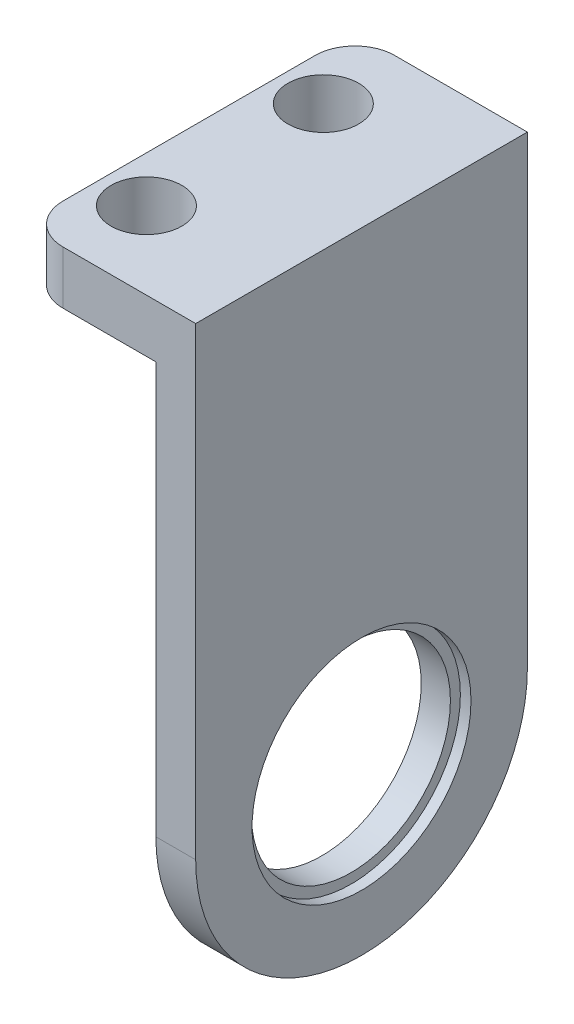
ISO-10303-21;
HEADER;
FILE_DESCRIPTION(('STEP AP214'),'2;1');
FILE_NAME('part.step','',(''),(''),'','','');
FILE_SCHEMA(('AUTOMOTIVE_DESIGN { 1 0 10303 214 1 1 1 1 }'));
ENDSEC;
DATA;
#1=APPLICATION_CONTEXT('core data for automotive mechanical design processes');
#2=APPLICATION_PROTOCOL_DEFINITION('international standard','automotive_design',2000,#1);
#3=PRODUCT_CONTEXT('',#1,'mechanical');
#4=PRODUCT('Part','Part','',(#3));
#5=PRODUCT_RELATED_PRODUCT_CATEGORY('part','',(#4));
#6=PRODUCT_DEFINITION_FORMATION('','',#4);
#7=PRODUCT_DEFINITION_CONTEXT('part definition',#1,'design');
#8=PRODUCT_DEFINITION('design','',#6,#7);
#9=PRODUCT_DEFINITION_SHAPE('','',#8);
#10=(LENGTH_UNIT() NAMED_UNIT(*) SI_UNIT(.MILLI.,.METRE.));
#11=(NAMED_UNIT(*) PLANE_ANGLE_UNIT() SI_UNIT($,.RADIAN.));
#12=(NAMED_UNIT(*) SI_UNIT($,.STERADIAN.) SOLID_ANGLE_UNIT());
#13=UNCERTAINTY_MEASURE_WITH_UNIT(LENGTH_MEASURE(1.E-05),#10,'distance_accuracy_value','');
#14=(GEOMETRIC_REPRESENTATION_CONTEXT(3) GLOBAL_UNCERTAINTY_ASSIGNED_CONTEXT((#13)) GLOBAL_UNIT_ASSIGNED_CONTEXT((#10,
#11,#12)) REPRESENTATION_CONTEXT('',''));
#15=CARTESIAN_POINT('',(0.,0.,0.));
#16=DIRECTION('',(0.,0.,1.));
#17=DIRECTION('',(1.,0.,0.));
#18=AXIS2_PLACEMENT_3D('',#15,#16,#17);
#19=CARTESIAN_POINT('',(1.72749349501262,7.87330291472182,0.));
#20=DIRECTION('',(-1.,0.,0.));
#21=DIRECTION('',(0.,0.,1.));
#22=AXIS2_PLACEMENT_3D('',#19,#20,#21);
#23=CYLINDRICAL_SURFACE('',#22,4.5);
#24=CARTESIAN_POINT('',(-0.072506504987384,7.87330291472182,0.));
#25=DIRECTION('',(1.,0.,0.));
#26=DIRECTION('',(0.,0.,-1.));
#27=AXIS2_PLACEMENT_3D('',#24,#25,#26);
#28=CIRCLE('',#27,4.5);
#29=CARTESIAN_POINT('',(-0.072506504987384,7.87330291472182,-4.5));
#30=VERTEX_POINT('',#29);
#31=EDGE_CURVE('E138',#30,#30,#28,.T.);
#32=ORIENTED_EDGE('',*,*,#31,.F.);
#33=EDGE_LOOP('',(#32));
#34=FACE_BOUND('',#33,.T.);
#35=CARTESIAN_POINT('',(1.24749349501262,7.87330291472182,0.));
#36=DIRECTION('',(1.,0.,0.));
#37=DIRECTION('',(0.,0.,-1.));
#38=AXIS2_PLACEMENT_3D('',#35,#36,#37);
#39=CIRCLE('',#38,4.5);
#40=CARTESIAN_POINT('',(1.24749349501262,7.87330291472182,-4.5));
#41=VERTEX_POINT('',#40);
#42=EDGE_CURVE('E122',#41,#41,#39,.T.);
#43=ORIENTED_EDGE('',*,*,#42,.T.);
#44=EDGE_LOOP('',(#43));
#45=FACE_BOUND('',#44,.T.);
#46=ADVANCED_FACE('F35',(#34,#45),#23,.F.);
#47=CARTESIAN_POINT('',(-0.072506504987384,7.87330291472182,0.));
#48=DIRECTION('',(1.,0.,0.));
#49=DIRECTION('',(0.,0.,-1.));
#50=AXIS2_PLACEMENT_3D('',#47,#48,#49);
#51=PLANE('',#50);
#52=ORIENTED_EDGE('',*,*,#31,.T.);
#53=EDGE_LOOP('',(#52));
#54=FACE_BOUND('',#53,.T.);
#55=DIRECTION('',(0.,0.,1.));
#56=VECTOR('',#55,1.);
#57=CARTESIAN_POINT('',(-0.072506504987384,26.4733029147218,7.5));
#58=LINE('',#57,#56);
#59=CARTESIAN_POINT('',(-0.072506504987384,26.4733029147218,-7.5));
#60=VERTEX_POINT('',#59);
#61=CARTESIAN_POINT('',(-0.072506504987384,26.4733029147218,7.5));
#62=VERTEX_POINT('',#61);
#63=EDGE_CURVE('E115',#60,#62,#58,.T.);
#64=ORIENTED_EDGE('',*,*,#63,.F.);
#65=DIRECTION('',(0.,1.,0.));
#66=VECTOR('',#65,1.);
#67=CARTESIAN_POINT('',(-0.072506504987384,7.87330291472182,-7.5));
#68=LINE('',#67,#66);
#69=CARTESIAN_POINT('',(-0.072506504987384,7.87330291472182,-7.5));
#70=VERTEX_POINT('',#69);
#71=EDGE_CURVE('E118',#70,#60,#68,.T.);
#72=ORIENTED_EDGE('',*,*,#71,.F.);
#73=CARTESIAN_POINT('',(-0.072506504987384,7.87330291472182,0.));
#74=DIRECTION('',(1.,0.,0.));
#75=DIRECTION('',(0.,0.,-1.));
#76=AXIS2_PLACEMENT_3D('',#73,#74,#75);
#77=CIRCLE('',#76,7.5);
#78=CARTESIAN_POINT('',(-0.072506504987384,7.87330291472182,7.5));
#79=VERTEX_POINT('',#78);
#80=EDGE_CURVE('E117',#79,#70,#77,.T.);
#81=ORIENTED_EDGE('',*,*,#80,.F.);
#82=DIRECTION('',(0.,-1.,0.));
#83=VECTOR('',#82,1.);
#84=CARTESIAN_POINT('',(-0.072506504987384,7.87330291472182,7.5));
#85=LINE('',#84,#83);
#86=EDGE_CURVE('E103',#62,#79,#85,.T.);
#87=ORIENTED_EDGE('',*,*,#86,.F.);
#88=EDGE_LOOP('',(#64,#72,#81,#87));
#89=FACE_BOUND('',#88,.T.);
#90=ADVANCED_FACE('F113',(#54,#89),#51,.F.);
#91=CARTESIAN_POINT('',(1.72749349501262,7.87330291472182,0.));
#92=DIRECTION('',(1.,0.,0.));
#93=DIRECTION('',(0.,0.,-1.));
#94=AXIS2_PLACEMENT_3D('',#91,#92,#93);
#95=PLANE('',#94);
#96=CARTESIAN_POINT('',(1.72749349501262,7.87330291472182,0.));
#97=DIRECTION('',(1.,0.,0.));
#98=DIRECTION('',(0.,0.,-1.));
#99=AXIS2_PLACEMENT_3D('',#96,#97,#98);
#100=CIRCLE('',#99,4.95);
#101=CARTESIAN_POINT('',(1.72749349501262,7.87330291472182,-4.95));
#102=VERTEX_POINT('',#101);
#103=EDGE_CURVE('E325',#102,#102,#100,.T.);
#104=ORIENTED_EDGE('',*,*,#103,.F.);
#105=EDGE_LOOP('',(#104));
#106=FACE_BOUND('',#105,.T.);
#107=DIRECTION('',(0.,1.,0.));
#108=VECTOR('',#107,1.);
#109=CARTESIAN_POINT('',(1.72749349501262,7.87330291472182,-7.5));
#110=LINE('',#109,#108);
#111=CARTESIAN_POINT('',(1.72749349501262,7.87330291472182,-7.5));
#112=VERTEX_POINT('',#111);
#113=CARTESIAN_POINT('',(1.72749349501262,28.8733029147218,-7.5));
#114=VERTEX_POINT('',#113);
#115=EDGE_CURVE('E141',#112,#114,#110,.T.);
#116=ORIENTED_EDGE('',*,*,#115,.T.);
#117=DIRECTION('',(0.,0.,1.));
#118=VECTOR('',#117,1.);
#119=CARTESIAN_POINT('',(1.72749349501262,28.8733029147218,7.5));
#120=LINE('',#119,#118);
#121=CARTESIAN_POINT('',(1.72749349501262,28.8733029147218,7.5));
#122=VERTEX_POINT('',#121);
#123=EDGE_CURVE('E144',#114,#122,#120,.T.);
#124=ORIENTED_EDGE('',*,*,#123,.T.);
#125=DIRECTION('',(0.,-1.,0.));
#126=VECTOR('',#125,1.);
#127=CARTESIAN_POINT('',(1.72749349501262,7.87330291472182,7.5));
#128=LINE('',#127,#126);
#129=CARTESIAN_POINT('',(1.72749349501262,7.87330291472182,7.5));
#130=VERTEX_POINT('',#129);
#131=EDGE_CURVE('E146',#122,#130,#128,.T.);
#132=ORIENTED_EDGE('',*,*,#131,.T.);
#133=CARTESIAN_POINT('',(1.72749349501262,7.87330291472182,0.));
#134=DIRECTION('',(1.,0.,0.));
#135=DIRECTION('',(0.,0.,-1.));
#136=AXIS2_PLACEMENT_3D('',#133,#134,#135);
#137=CIRCLE('',#136,7.5);
#138=EDGE_CURVE('E148',#130,#112,#137,.T.);
#139=ORIENTED_EDGE('',*,*,#138,.T.);
#140=EDGE_LOOP('',(#116,#124,#132,#139));
#141=FACE_BOUND('',#140,.T.);
#142=ADVANCED_FACE('F173',(#106,#141),#95,.T.);
#143=CARTESIAN_POINT('',(1.72749349501262,7.87330291472182,-7.5));
#144=DIRECTION('',(0.,0.,1.));
#145=DIRECTION('',(1.,0.,0.));
#146=AXIS2_PLACEMENT_3D('',#143,#144,#145);
#147=PLANE('',#146);
#148=DIRECTION('',(1.,0.,0.));
#149=VECTOR('',#148,1.);
#150=CARTESIAN_POINT('',(-6.07250650498738,26.4733029147218,-7.5));
#151=LINE('',#150,#149);
#152=CARTESIAN_POINT('',(-4.27250650498738,26.4733029147218,-7.5));
#153=VERTEX_POINT('',#152);
#154=EDGE_CURVE('E107',#153,#60,#151,.T.);
#155=ORIENTED_EDGE('',*,*,#154,.F.);
#156=DIRECTION('',(0.,-1.,0.));
#157=VECTOR('',#156,1.);
#158=CARTESIAN_POINT('',(-4.27250650498738,28.8733029147218,-7.5));
#159=LINE('',#158,#157);
#160=CARTESIAN_POINT('',(-4.27250650498738,28.8733029147218,-7.5));
#161=VERTEX_POINT('',#160);
#162=EDGE_CURVE('E11',#153,#161,#159,.F.);
#163=ORIENTED_EDGE('',*,*,#162,.T.);
#164=DIRECTION('',(-1.,0.,0.));
#165=VECTOR('',#164,1.);
#166=CARTESIAN_POINT('',(1.72749349501262,28.8733029147218,-7.5));
#167=LINE('',#166,#165);
#168=EDGE_CURVE('E155',#114,#161,#167,.T.);
#169=ORIENTED_EDGE('',*,*,#168,.F.);
#170=ORIENTED_EDGE('',*,*,#115,.F.);
#171=DIRECTION('',(-1.,0.,0.));
#172=VECTOR('',#171,1.);
#173=CARTESIAN_POINT('',(1.72749349501262,7.87330291472182,-7.5));
#174=LINE('',#173,#172);
#175=EDGE_CURVE('E150',#112,#70,#174,.T.);
#176=ORIENTED_EDGE('',*,*,#175,.T.);
#177=ORIENTED_EDGE('',*,*,#71,.T.);
#178=EDGE_LOOP('',(#155,#163,#169,#170,#176,#177));
#179=FACE_BOUND('',#178,.T.);
#180=ADVANCED_FACE('F170',(#179),#147,.F.);
#181=CARTESIAN_POINT('',(1.72749349501262,28.8733029147218,7.5));
#182=DIRECTION('',(0.,-1.,0.));
#183=DIRECTION('',(0.,0.,-1.));
#184=AXIS2_PLACEMENT_3D('',#181,#182,#183);
#185=PLANE('',#184);
#186=CARTESIAN_POINT('',(-4.,28.8733029147218,4.));
#187=DIRECTION('',(0.,1.,0.));
#188=DIRECTION('',(0.,0.,1.));
#189=AXIS2_PLACEMENT_3D('',#186,#187,#188);
#190=CIRCLE('',#189,1.6);
#191=CARTESIAN_POINT('',(-4.,28.8733029147218,5.6));
#192=VERTEX_POINT('',#191);
#193=EDGE_CURVE('E314',#192,#192,#190,.T.);
#194=ORIENTED_EDGE('',*,*,#193,.F.);
#195=EDGE_LOOP('',(#194));
#196=FACE_BOUND('',#195,.T.);
#197=CARTESIAN_POINT('',(-4.,28.8733029147218,-4.));
#198=DIRECTION('',(0.,1.,0.));
#199=DIRECTION('',(0.,0.,1.));
#200=AXIS2_PLACEMENT_3D('',#197,#198,#199);
#201=CIRCLE('',#200,1.6);
#202=CARTESIAN_POINT('',(-4.,28.8733029147218,-2.4));
#203=VERTEX_POINT('',#202);
#204=EDGE_CURVE('E317',#203,#203,#201,.T.);
#205=ORIENTED_EDGE('',*,*,#204,.F.);
#206=EDGE_LOOP('',(#205));
#207=FACE_BOUND('',#206,.T.);
#208=DIRECTION('',(0.,0.,-1.));
#209=VECTOR('',#208,1.);
#210=CARTESIAN_POINT('',(-6.07250650498738,28.8733029147218,7.5));
#211=LINE('',#210,#209);
#212=CARTESIAN_POINT('',(-6.07250650498738,28.8733029147218,5.7));
#213=VERTEX_POINT('',#212);
#214=CARTESIAN_POINT('',(-6.07250650498738,28.8733029147218,-5.7));
#215=VERTEX_POINT('',#214);
#216=EDGE_CURVE('E121',#213,#215,#211,.T.);
#217=ORIENTED_EDGE('',*,*,#216,.F.);
#218=CARTESIAN_POINT('',(-4.27250650498738,28.8733029147218,5.7));
#219=DIRECTION('',(0.,-1.,0.));
#220=DIRECTION('',(0.,0.,-1.));
#221=AXIS2_PLACEMENT_3D('',#218,#219,#220);
#222=CIRCLE('',#221,1.8);
#223=CARTESIAN_POINT('',(-4.27250650498738,28.8733029147218,7.5));
#224=VERTEX_POINT('',#223);
#225=EDGE_CURVE('E180',#213,#224,#222,.F.);
#226=ORIENTED_EDGE('',*,*,#225,.T.);
#227=DIRECTION('',(-1.,0.,0.));
#228=VECTOR('',#227,1.);
#229=CARTESIAN_POINT('',(1.72749349501262,28.8733029147218,7.5));
#230=LINE('',#229,#228);
#231=EDGE_CURVE('E159',#122,#224,#230,.T.);
#232=ORIENTED_EDGE('',*,*,#231,.F.);
#233=ORIENTED_EDGE('',*,*,#123,.F.);
#234=ORIENTED_EDGE('',*,*,#168,.T.);
#235=CARTESIAN_POINT('',(-4.27250650498738,28.8733029147218,-5.7));
#236=DIRECTION('',(0.,-1.,0.));
#237=DIRECTION('',(0.,0.,-1.));
#238=AXIS2_PLACEMENT_3D('',#235,#236,#237);
#239=CIRCLE('',#238,1.8);
#240=EDGE_CURVE('E184',#161,#215,#239,.F.);
#241=ORIENTED_EDGE('',*,*,#240,.T.);
#242=EDGE_LOOP('',(#217,#226,#232,#233,#234,#241));
#243=FACE_BOUND('',#242,.T.);
#244=ADVANCED_FACE('F196',(#196,#207,#243),#185,.F.);
#245=CARTESIAN_POINT('',(1.72749349501262,7.87330291472182,7.5));
#246=DIRECTION('',(0.,0.,-1.));
#247=DIRECTION('',(-1.,0.,0.));
#248=AXIS2_PLACEMENT_3D('',#245,#246,#247);
#249=PLANE('',#248);
#250=ORIENTED_EDGE('',*,*,#231,.T.);
#251=DIRECTION('',(0.,1.,0.));
#252=VECTOR('',#251,1.);
#253=CARTESIAN_POINT('',(-4.27250650498738,26.4733029147218,7.5));
#254=LINE('',#253,#252);
#255=CARTESIAN_POINT('',(-4.27250650498738,26.4733029147218,7.5));
#256=VERTEX_POINT('',#255);
#257=EDGE_CURVE('E60',#224,#256,#254,.F.);
#258=ORIENTED_EDGE('',*,*,#257,.T.);
#259=DIRECTION('',(1.,0.,0.));
#260=VECTOR('',#259,1.);
#261=CARTESIAN_POINT('',(-6.07250650498738,26.4733029147218,7.5));
#262=LINE('',#261,#260);
#263=EDGE_CURVE('E99',#256,#62,#262,.T.);
#264=ORIENTED_EDGE('',*,*,#263,.T.);
#265=ORIENTED_EDGE('',*,*,#86,.T.);
#266=DIRECTION('',(-1.,0.,0.));
#267=VECTOR('',#266,1.);
#268=CARTESIAN_POINT('',(1.72749349501262,7.87330291472182,7.5));
#269=LINE('',#268,#267);
#270=EDGE_CURVE('E161',#130,#79,#269,.T.);
#271=ORIENTED_EDGE('',*,*,#270,.F.);
#272=ORIENTED_EDGE('',*,*,#131,.F.);
#273=EDGE_LOOP('',(#250,#258,#264,#265,#271,#272));
#274=FACE_BOUND('',#273,.T.);
#275=ADVANCED_FACE('F101',(#274),#249,.F.);
#276=CARTESIAN_POINT('',(1.72749349501262,7.87330291472182,0.));
#277=DIRECTION('',(-1.,0.,0.));
#278=DIRECTION('',(0.,0.,1.));
#279=AXIS2_PLACEMENT_3D('',#276,#277,#278);
#280=CYLINDRICAL_SURFACE('',#279,7.5);
#281=ORIENTED_EDGE('',*,*,#80,.T.);
#282=ORIENTED_EDGE('',*,*,#175,.F.);
#283=ORIENTED_EDGE('',*,*,#138,.F.);
#284=ORIENTED_EDGE('',*,*,#270,.T.);
#285=EDGE_LOOP('',(#281,#282,#283,#284));
#286=FACE_BOUND('',#285,.T.);
#287=ADVANCED_FACE('F166',(#286),#280,.T.);
#288=CARTESIAN_POINT('',(-6.07250650498738,26.4733029147218,7.5));
#289=DIRECTION('',(0.,1.,0.));
#290=DIRECTION('',(0.,0.,1.));
#291=AXIS2_PLACEMENT_3D('',#288,#289,#290);
#292=PLANE('',#291);
#293=CARTESIAN_POINT('',(-4.,26.4733029147218,4.));
#294=DIRECTION('',(0.,1.,0.));
#295=DIRECTION('',(0.,0.,1.));
#296=AXIS2_PLACEMENT_3D('',#293,#294,#295);
#297=CIRCLE('',#296,1.6);
#298=CARTESIAN_POINT('',(-4.,26.4733029147218,5.6));
#299=VERTEX_POINT('',#298);
#300=EDGE_CURVE('E39',#299,#299,#297,.T.);
#301=ORIENTED_EDGE('',*,*,#300,.T.);
#302=EDGE_LOOP('',(#301));
#303=FACE_BOUND('',#302,.T.);
#304=CARTESIAN_POINT('',(-4.,26.4733029147218,-4.));
#305=DIRECTION('',(0.,1.,0.));
#306=DIRECTION('',(0.,0.,1.));
#307=AXIS2_PLACEMENT_3D('',#304,#305,#306);
#308=CIRCLE('',#307,1.6);
#309=CARTESIAN_POINT('',(-4.,26.4733029147218,-2.4));
#310=VERTEX_POINT('',#309);
#311=EDGE_CURVE('E319',#310,#310,#308,.T.);
#312=ORIENTED_EDGE('',*,*,#311,.T.);
#313=EDGE_LOOP('',(#312));
#314=FACE_BOUND('',#313,.T.);
#315=ORIENTED_EDGE('',*,*,#263,.F.);
#316=CARTESIAN_POINT('',(-4.27250650498738,26.4733029147218,5.7));
#317=DIRECTION('',(0.,1.,0.));
#318=DIRECTION('',(0.,0.,1.));
#319=AXIS2_PLACEMENT_3D('',#316,#317,#318);
#320=CIRCLE('',#319,1.8);
#321=CARTESIAN_POINT('',(-6.07250650498738,26.4733029147218,5.7));
#322=VERTEX_POINT('',#321);
#323=EDGE_CURVE('E44',#256,#322,#320,.F.);
#324=ORIENTED_EDGE('',*,*,#323,.T.);
#325=DIRECTION('',(0.,0.,1.));
#326=VECTOR('',#325,1.);
#327=CARTESIAN_POINT('',(-6.07250650498738,26.4733029147218,7.5));
#328=LINE('',#327,#326);
#329=CARTESIAN_POINT('',(-6.07250650498738,26.4733029147218,-5.7));
#330=VERTEX_POINT('',#329);
#331=EDGE_CURVE('E108',#330,#322,#328,.T.);
#332=ORIENTED_EDGE('',*,*,#331,.F.);
#333=CARTESIAN_POINT('',(-4.27250650498738,26.4733029147218,-5.7));
#334=DIRECTION('',(0.,1.,0.));
#335=DIRECTION('',(0.,0.,1.));
#336=AXIS2_PLACEMENT_3D('',#333,#334,#335);
#337=CIRCLE('',#336,1.8);
#338=EDGE_CURVE('E52',#330,#153,#337,.F.);
#339=ORIENTED_EDGE('',*,*,#338,.T.);
#340=ORIENTED_EDGE('',*,*,#154,.T.);
#341=ORIENTED_EDGE('',*,*,#63,.T.);
#342=EDGE_LOOP('',(#315,#324,#332,#339,#340,#341));
#343=FACE_BOUND('',#342,.T.);
#344=ADVANCED_FACE('F120',(#303,#314,#343),#292,.F.);
#345=CARTESIAN_POINT('',(-6.07250650498738,7.87330291472182,0.));
#346=DIRECTION('',(-1.,0.,0.));
#347=DIRECTION('',(0.,0.,1.));
#348=AXIS2_PLACEMENT_3D('',#345,#346,#347);
#349=PLANE('',#348);
#350=ORIENTED_EDGE('',*,*,#331,.T.);
#351=DIRECTION('',(0.,1.,0.));
#352=VECTOR('',#351,1.);
#353=CARTESIAN_POINT('',(-6.07250650498738,28.8733029147218,5.7));
#354=LINE('',#353,#352);
#355=EDGE_CURVE('E192',#322,#213,#354,.T.);
#356=ORIENTED_EDGE('',*,*,#355,.T.);
#357=ORIENTED_EDGE('',*,*,#216,.T.);
#358=DIRECTION('',(0.,-1.,0.));
#359=VECTOR('',#358,1.);
#360=CARTESIAN_POINT('',(-6.07250650498738,26.4733029147218,-5.7));
#361=LINE('',#360,#359);
#362=EDGE_CURVE('E158',#215,#330,#361,.T.);
#363=ORIENTED_EDGE('',*,*,#362,.T.);
#364=EDGE_LOOP('',(#350,#356,#357,#363));
#365=FACE_BOUND('',#364,.T.);
#366=ADVANCED_FACE('F202',(#365),#349,.T.);
#367=CARTESIAN_POINT('',(-4.27250650498738,7.87330291472182,5.7));
#368=DIRECTION('',(0.,-1.,0.));
#369=DIRECTION('',(0.,0.,-1.));
#370=AXIS2_PLACEMENT_3D('',#367,#368,#369);
#371=CYLINDRICAL_SURFACE('',#370,1.8);
#372=ORIENTED_EDGE('',*,*,#323,.F.);
#373=ORIENTED_EDGE('',*,*,#257,.F.);
#374=ORIENTED_EDGE('',*,*,#225,.F.);
#375=ORIENTED_EDGE('',*,*,#355,.F.);
#376=EDGE_LOOP('',(#372,#373,#374,#375));
#377=FACE_BOUND('',#376,.T.);
#378=ADVANCED_FACE('F178',(#377),#371,.T.);
#379=CARTESIAN_POINT('',(-4.27250650498738,7.87330291472182,-5.7));
#380=DIRECTION('',(0.,1.,0.));
#381=DIRECTION('',(0.,0.,1.));
#382=AXIS2_PLACEMENT_3D('',#379,#380,#381);
#383=CYLINDRICAL_SURFACE('',#382,1.8);
#384=ORIENTED_EDGE('',*,*,#240,.F.);
#385=ORIENTED_EDGE('',*,*,#162,.F.);
#386=ORIENTED_EDGE('',*,*,#338,.F.);
#387=ORIENTED_EDGE('',*,*,#362,.F.);
#388=EDGE_LOOP('',(#384,#385,#386,#387));
#389=FACE_BOUND('',#388,.T.);
#390=ADVANCED_FACE('F37',(#389),#383,.T.);
#391=CARTESIAN_POINT('',(1.24749349501262,7.87330291472182,0.));
#392=DIRECTION('',(1.,0.,0.));
#393=DIRECTION('',(0.,0.,-1.));
#394=AXIS2_PLACEMENT_3D('',#391,#392,#393);
#395=CYLINDRICAL_SURFACE('',#394,4.95);
#396=CARTESIAN_POINT('',(1.24749349501262,7.87330291472182,0.));
#397=DIRECTION('',(1.,0.,0.));
#398=DIRECTION('',(0.,0.,-1.));
#399=AXIS2_PLACEMENT_3D('',#396,#397,#398);
#400=CIRCLE('',#399,4.95);
#401=CARTESIAN_POINT('',(1.24749349501262,7.87330291472182,-4.95));
#402=VERTEX_POINT('',#401);
#403=EDGE_CURVE('E127',#402,#402,#400,.T.);
#404=ORIENTED_EDGE('',*,*,#403,.F.);
#405=EDGE_LOOP('',(#404));
#406=FACE_BOUND('',#405,.T.);
#407=ORIENTED_EDGE('',*,*,#103,.T.);
#408=EDGE_LOOP('',(#407));
#409=FACE_BOUND('',#408,.T.);
#410=ADVANCED_FACE('F204',(#406,#409),#395,.F.);
#411=CARTESIAN_POINT('',(1.24749349501262,7.87330291472182,0.));
#412=DIRECTION('',(1.,0.,0.));
#413=DIRECTION('',(0.,0.,-1.));
#414=AXIS2_PLACEMENT_3D('',#411,#412,#413);
#415=PLANE('',#414);
#416=ORIENTED_EDGE('',*,*,#42,.F.);
#417=EDGE_LOOP('',(#416));
#418=FACE_BOUND('',#417,.T.);
#419=ORIENTED_EDGE('',*,*,#403,.T.);
#420=EDGE_LOOP('',(#419));
#421=FACE_BOUND('',#420,.T.);
#422=ADVANCED_FACE('F209',(#418,#421),#415,.T.);
#423=CARTESIAN_POINT('',(-4.,23.8733029147218,-4.));
#424=DIRECTION('',(0.,1.,0.));
#425=DIRECTION('',(0.,0.,1.));
#426=AXIS2_PLACEMENT_3D('',#423,#424,#425);
#427=CYLINDRICAL_SURFACE('',#426,1.6);
#428=ORIENTED_EDGE('',*,*,#204,.T.);
#429=EDGE_LOOP('',(#428));
#430=FACE_BOUND('',#429,.T.);
#431=ORIENTED_EDGE('',*,*,#311,.F.);
#432=EDGE_LOOP('',(#431));
#433=FACE_BOUND('',#432,.T.);
#434=ADVANCED_FACE('F287',(#430,#433),#427,.F.);
#435=CARTESIAN_POINT('',(-4.,23.8733029147218,4.));
#436=DIRECTION('',(0.,1.,0.));
#437=DIRECTION('',(0.,0.,1.));
#438=AXIS2_PLACEMENT_3D('',#435,#436,#437);
#439=CYLINDRICAL_SURFACE('',#438,1.6);
#440=ORIENTED_EDGE('',*,*,#193,.T.);
#441=EDGE_LOOP('',(#440));
#442=FACE_BOUND('',#441,.T.);
#443=ORIENTED_EDGE('',*,*,#300,.F.);
#444=EDGE_LOOP('',(#443));
#445=FACE_BOUND('',#444,.T.);
#446=ADVANCED_FACE('F297',(#442,#445),#439,.F.);
#447=CLOSED_SHELL('',(#46,#90,#142,#180,#244,#275,#287,#344,#366,#378,#390,#410,#422,#434,#446));
#448=MANIFOLD_SOLID_BREP('B2',#447);
#449=ADVANCED_BREP_SHAPE_REPRESENTATION('',(#18,#448),#14);
#450=SHAPE_DEFINITION_REPRESENTATION(#9,#449);
ENDSEC;
END-ISO-10303-21;
